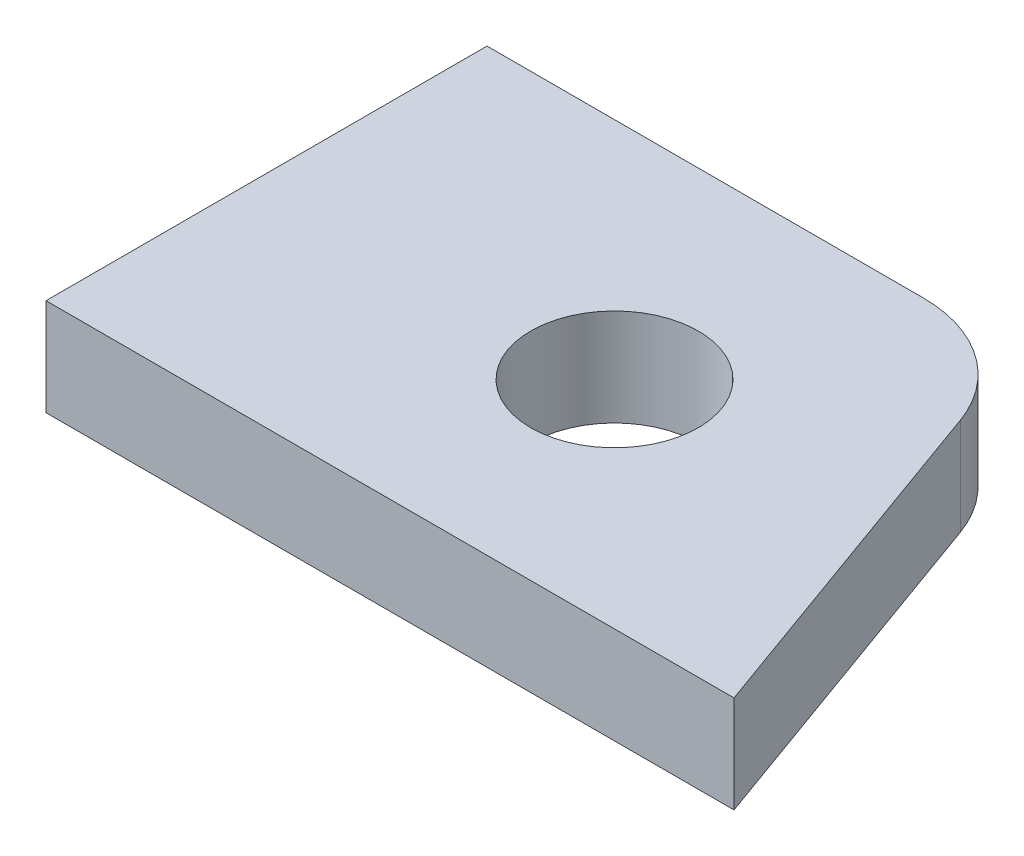
ISO-10303-21;
HEADER;
FILE_DESCRIPTION(('STEP AP214'),'2;1');
FILE_NAME('part.step','',(''),(''),'','','');
FILE_SCHEMA(('AUTOMOTIVE_DESIGN { 1 0 10303 214 1 1 1 1 }'));
ENDSEC;
DATA;
#1=APPLICATION_CONTEXT('core data for automotive mechanical design processes');
#2=APPLICATION_PROTOCOL_DEFINITION('international standard','automotive_design',2000,#1);
#3=PRODUCT_CONTEXT('',#1,'mechanical');
#4=PRODUCT('Part','Part','',(#3));
#5=PRODUCT_RELATED_PRODUCT_CATEGORY('part','',(#4));
#6=PRODUCT_DEFINITION_FORMATION('','',#4);
#7=PRODUCT_DEFINITION_CONTEXT('part definition',#1,'design');
#8=PRODUCT_DEFINITION('design','',#6,#7);
#9=PRODUCT_DEFINITION_SHAPE('','',#8);
#10=(LENGTH_UNIT() NAMED_UNIT(*) SI_UNIT(.MILLI.,.METRE.));
#11=(NAMED_UNIT(*) PLANE_ANGLE_UNIT() SI_UNIT($,.RADIAN.));
#12=(NAMED_UNIT(*) SI_UNIT($,.STERADIAN.) SOLID_ANGLE_UNIT());
#13=UNCERTAINTY_MEASURE_WITH_UNIT(LENGTH_MEASURE(1.E-05),#10,'distance_accuracy_value','');
#14=(GEOMETRIC_REPRESENTATION_CONTEXT(3) GLOBAL_UNCERTAINTY_ASSIGNED_CONTEXT((#13)) GLOBAL_UNIT_ASSIGNED_CONTEXT((#10,
#11,#12)) REPRESENTATION_CONTEXT('',''));
#15=CARTESIAN_POINT('',(0.,0.,0.));
#16=DIRECTION('',(0.,0.,1.));
#17=DIRECTION('',(1.,0.,0.));
#18=AXIS2_PLACEMENT_3D('',#15,#16,#17);
#19=CARTESIAN_POINT('',(49.4576036932963,11.,-35.));
#20=DIRECTION('',(0.,-1.,0.));
#21=DIRECTION('',(0.,0.,-1.));
#22=AXIS2_PLACEMENT_3D('',#19,#20,#21);
#23=PLANE('',#22);
#24=DIRECTION('',(0.,0.,1.));
#25=VECTOR('',#24,1.);
#26=CARTESIAN_POINT('',(0.,11.,0.));
#27=LINE('',#26,#25);
#28=CARTESIAN_POINT('',(0.,11.,-50.));
#29=VERTEX_POINT('',#28);
#30=CARTESIAN_POINT('',(0.,11.,0.));
#31=VERTEX_POINT('',#30);
#32=EDGE_CURVE('E139',#29,#31,#27,.T.);
#33=ORIENTED_EDGE('',*,*,#32,.T.);
#34=DIRECTION('',(1.,0.,0.));
#35=VECTOR('',#34,1.);
#36=CARTESIAN_POINT('',(0.,11.,0.));
#37=LINE('',#36,#35);
#38=CARTESIAN_POINT('',(78.,11.,0.));
#39=VERTEX_POINT('',#38);
#40=EDGE_CURVE('E97',#31,#39,#37,.T.);
#41=ORIENTED_EDGE('',*,*,#40,.T.);
#42=DIRECTION('',(-0.338719468272742,0.,-0.940887411868727));
#43=VECTOR('',#42,1.);
#44=CARTESIAN_POINT('',(63.5709148713272,11.,-40.0807920240911));
#45=LINE('',#44,#43);
#46=CARTESIAN_POINT('',(63.5709148713272,11.,-40.0807920240911));
#47=VERTEX_POINT('',#46);
#48=EDGE_CURVE('E101',#39,#47,#45,.T.);
#49=ORIENTED_EDGE('',*,*,#48,.T.);
#50=CARTESIAN_POINT('',(49.4576036932963,11.,-35.));
#51=DIRECTION('',(0.,1.,0.));
#52=DIRECTION('',(0.,0.,-1.));
#53=AXIS2_PLACEMENT_3D('',#50,#51,#52);
#54=CIRCLE('',#53,15.);
#55=CARTESIAN_POINT('',(49.4576036932962,11.,-50.));
#56=VERTEX_POINT('',#55);
#57=EDGE_CURVE('E105',#47,#56,#54,.T.);
#58=ORIENTED_EDGE('',*,*,#57,.T.);
#59=DIRECTION('',(-1.,0.,0.));
#60=VECTOR('',#59,1.);
#61=CARTESIAN_POINT('',(0.,11.,-50.));
#62=LINE('',#61,#60);
#63=EDGE_CURVE('E63',#56,#29,#62,.T.);
#64=ORIENTED_EDGE('',*,*,#63,.T.);
#65=EDGE_LOOP('',(#33,#41,#49,#58,#64));
#66=FACE_BOUND('',#65,.T.);
#67=CARTESIAN_POINT('',(39.9522734377099,11.,-24.5));
#68=DIRECTION('',(0.,1.,0.));
#69=DIRECTION('',(0.,0.,1.));
#70=AXIS2_PLACEMENT_3D('',#67,#68,#69);
#71=CIRCLE('',#70,9.5);
#72=CARTESIAN_POINT('',(39.9522734377099,11.,-15.));
#73=VERTEX_POINT('',#72);
#74=EDGE_CURVE('E130',#73,#73,#71,.T.);
#75=ORIENTED_EDGE('',*,*,#74,.F.);
#76=EDGE_LOOP('',(#75));
#77=FACE_BOUND('',#76,.T.);
#78=ADVANCED_FACE('F45',(#66,#77),#23,.F.);
#79=CARTESIAN_POINT('',(49.4576036932963,0.,-35.));
#80=DIRECTION('',(0.,-1.,0.));
#81=DIRECTION('',(0.,0.,-1.));
#82=AXIS2_PLACEMENT_3D('',#79,#80,#81);
#83=PLANE('',#82);
#84=DIRECTION('',(0.,0.,1.));
#85=VECTOR('',#84,1.);
#86=CARTESIAN_POINT('',(0.,0.,0.));
#87=LINE('',#86,#85);
#88=CARTESIAN_POINT('',(0.,0.,-50.));
#89=VERTEX_POINT('',#88);
#90=CARTESIAN_POINT('',(0.,0.,0.));
#91=VERTEX_POINT('',#90);
#92=EDGE_CURVE('E125',#89,#91,#87,.T.);
#93=ORIENTED_EDGE('',*,*,#92,.F.);
#94=DIRECTION('',(-1.,0.,0.));
#95=VECTOR('',#94,1.);
#96=CARTESIAN_POINT('',(0.,0.,-50.));
#97=LINE('',#96,#95);
#98=CARTESIAN_POINT('',(49.4576036932962,0.,-50.));
#99=VERTEX_POINT('',#98);
#100=EDGE_CURVE('E89',#99,#89,#97,.T.);
#101=ORIENTED_EDGE('',*,*,#100,.F.);
#102=CARTESIAN_POINT('',(49.4576036932963,0.,-35.));
#103=DIRECTION('',(0.,1.,0.));
#104=DIRECTION('',(0.,0.,-1.));
#105=AXIS2_PLACEMENT_3D('',#102,#103,#104);
#106=CIRCLE('',#105,15.);
#107=CARTESIAN_POINT('',(63.5709148713272,0.,-40.0807920240911));
#108=VERTEX_POINT('',#107);
#109=EDGE_CURVE('E83',#108,#99,#106,.T.);
#110=ORIENTED_EDGE('',*,*,#109,.F.);
#111=DIRECTION('',(-0.338719468272742,0.,-0.940887411868727));
#112=VECTOR('',#111,1.);
#113=CARTESIAN_POINT('',(63.5709148713272,0.,-40.0807920240911));
#114=LINE('',#113,#112);
#115=CARTESIAN_POINT('',(78.,0.,0.));
#116=VERTEX_POINT('',#115);
#117=EDGE_CURVE('E113',#116,#108,#114,.T.);
#118=ORIENTED_EDGE('',*,*,#117,.F.);
#119=DIRECTION('',(1.,0.,0.));
#120=VECTOR('',#119,1.);
#121=CARTESIAN_POINT('',(0.,0.,0.));
#122=LINE('',#121,#120);
#123=EDGE_CURVE('E129',#91,#116,#122,.T.);
#124=ORIENTED_EDGE('',*,*,#123,.F.);
#125=EDGE_LOOP('',(#93,#101,#110,#118,#124));
#126=FACE_BOUND('',#125,.T.);
#127=CARTESIAN_POINT('',(39.9522734377099,0.,-24.5));
#128=DIRECTION('',(0.,1.,0.));
#129=DIRECTION('',(0.,0.,1.));
#130=AXIS2_PLACEMENT_3D('',#127,#128,#129);
#131=CIRCLE('',#130,9.5);
#132=CARTESIAN_POINT('',(39.9522734377099,0.,-15.));
#133=VERTEX_POINT('',#132);
#134=EDGE_CURVE('E222',#133,#133,#131,.T.);
#135=ORIENTED_EDGE('',*,*,#134,.T.);
#136=EDGE_LOOP('',(#135));
#137=FACE_BOUND('',#136,.T.);
#138=ADVANCED_FACE('F146',(#126,#137),#83,.T.);
#139=CARTESIAN_POINT('',(0.,11.,0.));
#140=DIRECTION('',(1.,0.,0.));
#141=DIRECTION('',(0.,0.,-1.));
#142=AXIS2_PLACEMENT_3D('',#139,#140,#141);
#143=PLANE('',#142);
#144=ORIENTED_EDGE('',*,*,#92,.T.);
#145=DIRECTION('',(0.,-1.,0.));
#146=VECTOR('',#145,1.);
#147=CARTESIAN_POINT('',(0.,11.,0.));
#148=LINE('',#147,#146);
#149=EDGE_CURVE('E11',#31,#91,#148,.T.);
#150=ORIENTED_EDGE('',*,*,#149,.F.);
#151=ORIENTED_EDGE('',*,*,#32,.F.);
#152=DIRECTION('',(0.,-1.,0.));
#153=VECTOR('',#152,1.);
#154=CARTESIAN_POINT('',(0.,11.,-50.));
#155=LINE('',#154,#153);
#156=EDGE_CURVE('E121',#29,#89,#155,.T.);
#157=ORIENTED_EDGE('',*,*,#156,.T.);
#158=EDGE_LOOP('',(#144,#150,#151,#157));
#159=FACE_BOUND('',#158,.T.);
#160=ADVANCED_FACE('F47',(#159),#143,.F.);
#161=CARTESIAN_POINT('',(0.,11.,0.));
#162=DIRECTION('',(0.,0.,-1.));
#163=DIRECTION('',(-1.,0.,0.));
#164=AXIS2_PLACEMENT_3D('',#161,#162,#163);
#165=PLANE('',#164);
#166=ORIENTED_EDGE('',*,*,#123,.T.);
#167=DIRECTION('',(0.,-1.,0.));
#168=VECTOR('',#167,1.);
#169=CARTESIAN_POINT('',(78.,11.,0.));
#170=LINE('',#169,#168);
#171=EDGE_CURVE('E55',#39,#116,#170,.T.);
#172=ORIENTED_EDGE('',*,*,#171,.F.);
#173=ORIENTED_EDGE('',*,*,#40,.F.);
#174=ORIENTED_EDGE('',*,*,#149,.T.);
#175=EDGE_LOOP('',(#166,#172,#173,#174));
#176=FACE_BOUND('',#175,.T.);
#177=ADVANCED_FACE('F171',(#176),#165,.F.);
#178=CARTESIAN_POINT('',(63.5709148713272,11.,-40.0807920240911));
#179=DIRECTION('',(-0.940887411868727,0.,0.338719468272742));
#180=DIRECTION('',(0.338719468272742,0.,0.940887411868727));
#181=AXIS2_PLACEMENT_3D('',#178,#179,#180);
#182=PLANE('',#181);
#183=ORIENTED_EDGE('',*,*,#117,.T.);
#184=DIRECTION('',(0.,-1.,0.));
#185=VECTOR('',#184,1.);
#186=CARTESIAN_POINT('',(63.5709148713272,11.,-40.0807920240911));
#187=LINE('',#186,#185);
#188=EDGE_CURVE('E110',#47,#108,#187,.T.);
#189=ORIENTED_EDGE('',*,*,#188,.F.);
#190=ORIENTED_EDGE('',*,*,#48,.F.);
#191=ORIENTED_EDGE('',*,*,#171,.T.);
#192=EDGE_LOOP('',(#183,#189,#190,#191));
#193=FACE_BOUND('',#192,.T.);
#194=ADVANCED_FACE('F111',(#193),#182,.F.);
#195=CARTESIAN_POINT('',(49.4576036932963,11.,-35.));
#196=DIRECTION('',(0.,-1.,0.));
#197=DIRECTION('',(0.,0.,-1.));
#198=AXIS2_PLACEMENT_3D('',#195,#196,#197);
#199=CYLINDRICAL_SURFACE('',#198,15.);
#200=ORIENTED_EDGE('',*,*,#109,.T.);
#201=DIRECTION('',(0.,-1.,0.));
#202=VECTOR('',#201,1.);
#203=CARTESIAN_POINT('',(49.4576036932962,11.,-50.));
#204=LINE('',#203,#202);
#205=EDGE_CURVE('E115',#56,#99,#204,.T.);
#206=ORIENTED_EDGE('',*,*,#205,.F.);
#207=ORIENTED_EDGE('',*,*,#57,.F.);
#208=ORIENTED_EDGE('',*,*,#188,.T.);
#209=EDGE_LOOP('',(#200,#206,#207,#208));
#210=FACE_BOUND('',#209,.T.);
#211=ADVANCED_FACE('F117',(#210),#199,.T.);
#212=CARTESIAN_POINT('',(0.,11.,-50.));
#213=DIRECTION('',(0.,0.,1.));
#214=DIRECTION('',(1.,0.,0.));
#215=AXIS2_PLACEMENT_3D('',#212,#213,#214);
#216=PLANE('',#215);
#217=ORIENTED_EDGE('',*,*,#100,.T.);
#218=ORIENTED_EDGE('',*,*,#156,.F.);
#219=ORIENTED_EDGE('',*,*,#63,.F.);
#220=ORIENTED_EDGE('',*,*,#205,.T.);
#221=EDGE_LOOP('',(#217,#218,#219,#220));
#222=FACE_BOUND('',#221,.T.);
#223=ADVANCED_FACE('F151',(#222),#216,.F.);
#224=CARTESIAN_POINT('',(39.9522734377099,11.,-24.5));
#225=DIRECTION('',(0.,-1.,0.));
#226=DIRECTION('',(0.,0.,-1.));
#227=AXIS2_PLACEMENT_3D('',#224,#225,#226);
#228=CYLINDRICAL_SURFACE('',#227,9.5);
#229=ORIENTED_EDGE('',*,*,#74,.T.);
#230=EDGE_LOOP('',(#229));
#231=FACE_BOUND('',#230,.T.);
#232=ORIENTED_EDGE('',*,*,#134,.F.);
#233=EDGE_LOOP('',(#232));
#234=FACE_BOUND('',#233,.T.);
#235=ADVANCED_FACE('F153',(#231,#234),#228,.F.);
#236=CLOSED_SHELL('',(#78,#138,#160,#177,#194,#211,#223,#235));
#237=MANIFOLD_SOLID_BREP('B2',#236);
#238=ADVANCED_BREP_SHAPE_REPRESENTATION('',(#18,#237),#14);
#239=SHAPE_DEFINITION_REPRESENTATION(#9,#238);
ENDSEC;
END-ISO-10303-21;
